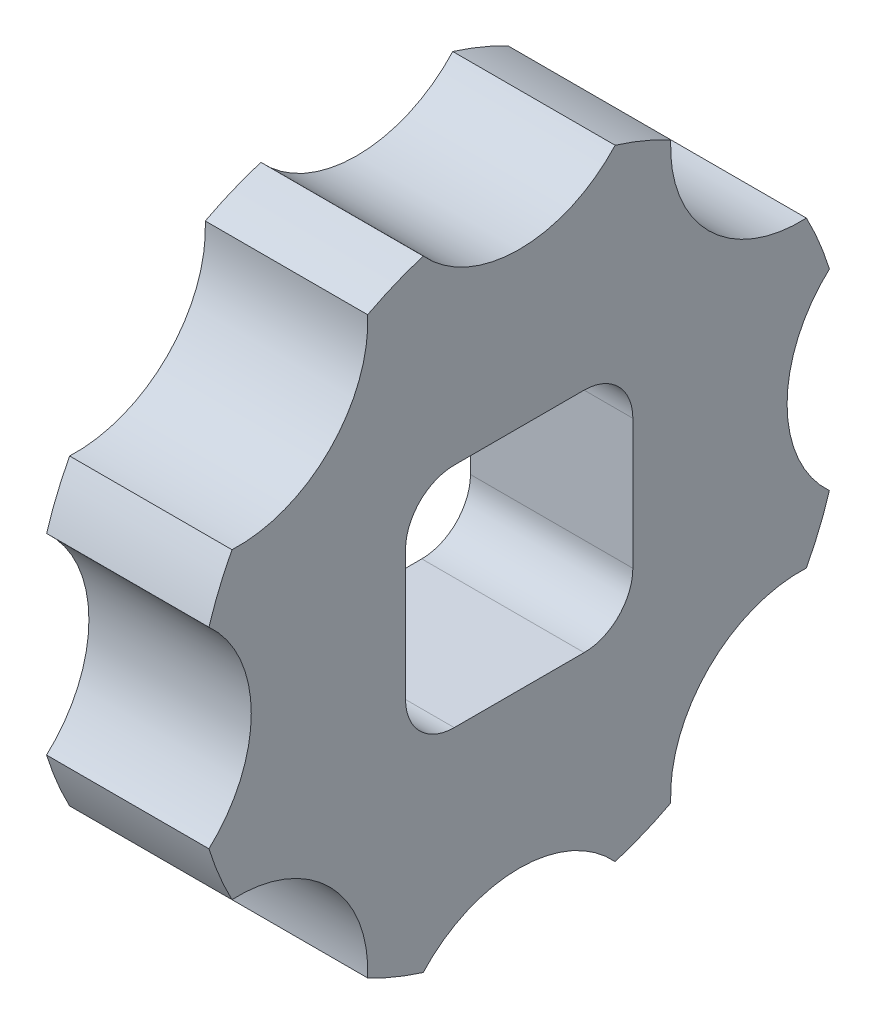
ISO-10303-21;
HEADER;
FILE_DESCRIPTION(('STEP AP214'),'2;1');
FILE_NAME('part.step','',(''),(''),'','','');
FILE_SCHEMA(('AUTOMOTIVE_DESIGN { 1 0 10303 214 1 1 1 1 }'));
ENDSEC;
DATA;
#1=APPLICATION_CONTEXT('core data for automotive mechanical design processes');
#2=APPLICATION_PROTOCOL_DEFINITION('international standard','automotive_design',2000,#1);
#3=PRODUCT_CONTEXT('',#1,'mechanical');
#4=PRODUCT('Part','Part','',(#3));
#5=PRODUCT_RELATED_PRODUCT_CATEGORY('part','',(#4));
#6=PRODUCT_DEFINITION_FORMATION('','',#4);
#7=PRODUCT_DEFINITION_CONTEXT('part definition',#1,'design');
#8=PRODUCT_DEFINITION('design','',#6,#7);
#9=PRODUCT_DEFINITION_SHAPE('','',#8);
#10=(LENGTH_UNIT() NAMED_UNIT(*) SI_UNIT(.MILLI.,.METRE.));
#11=(NAMED_UNIT(*) PLANE_ANGLE_UNIT() SI_UNIT($,.RADIAN.));
#12=(NAMED_UNIT(*) SI_UNIT($,.STERADIAN.) SOLID_ANGLE_UNIT());
#13=UNCERTAINTY_MEASURE_WITH_UNIT(LENGTH_MEASURE(1.E-05),#10,'distance_accuracy_value','');
#14=(GEOMETRIC_REPRESENTATION_CONTEXT(3) GLOBAL_UNCERTAINTY_ASSIGNED_CONTEXT((#13)) GLOBAL_UNIT_ASSIGNED_CONTEXT((#10,
#11,#12)) REPRESENTATION_CONTEXT('',''));
#15=CARTESIAN_POINT('',(0.,0.,0.));
#16=DIRECTION('',(0.,0.,1.));
#17=DIRECTION('',(1.,0.,0.));
#18=AXIS2_PLACEMENT_3D('',#15,#16,#17);
#19=CARTESIAN_POINT('',(10.,0.,0.));
#20=DIRECTION('',(-1.,0.,0.));
#21=DIRECTION('',(0.,0.,1.));
#22=AXIS2_PLACEMENT_3D('',#19,#20,#21);
#23=CYLINDRICAL_SURFACE('',#22,20.);
#24=CARTESIAN_POINT('',(0.,0.,0.));
#25=DIRECTION('',(1.,0.,0.));
#26=DIRECTION('',(0.,0.,-1.));
#27=AXIS2_PLACEMENT_3D('',#24,#25,#26);
#28=CIRCLE('',#27,20.);
#29=CARTESIAN_POINT('',(0.,-17.6891327679564,9.33244779881522));
#30=VERTEX_POINT('',#29);
#31=CARTESIAN_POINT('',(0.,-19.1071428571429,5.90906860991933));
#32=VERTEX_POINT('',#31);
#33=EDGE_CURVE('E216',#30,#32,#28,.T.);
#34=ORIENTED_EDGE('',*,*,#33,.T.);
#35=DIRECTION('',(1.,0.,0.));
#36=VECTOR('',#35,1.);
#37=CARTESIAN_POINT('',(5.,-19.1071428571429,5.90906860991933));
#38=LINE('',#37,#36);
#39=CARTESIAN_POINT('',(10.,-19.1071428571429,5.90906860991933));
#40=VERTEX_POINT('',#39);
#41=EDGE_CURVE('E62',#32,#40,#38,.T.);
#42=ORIENTED_EDGE('',*,*,#41,.T.);
#43=CARTESIAN_POINT('',(10.,0.,0.));
#44=DIRECTION('',(1.,0.,0.));
#45=DIRECTION('',(0.,0.,-1.));
#46=AXIS2_PLACEMENT_3D('',#43,#44,#45);
#47=CIRCLE('',#46,20.);
#48=CARTESIAN_POINT('',(10.,-17.6891327679564,9.33244779881522));
#49=VERTEX_POINT('',#48);
#50=EDGE_CURVE('E218',#49,#40,#47,.T.);
#51=ORIENTED_EDGE('',*,*,#50,.F.);
#52=DIRECTION('',(1.,0.,0.));
#53=VECTOR('',#52,1.);
#54=CARTESIAN_POINT('',(5.,-17.6891327679564,9.33244779881522));
#55=LINE('',#54,#53);
#56=EDGE_CURVE('E201',#49,#30,#55,.F.);
#57=ORIENTED_EDGE('',*,*,#56,.T.);
#58=EDGE_LOOP('',(#34,#42,#51,#57));
#59=FACE_BOUND('',#58,.T.);
#60=ADVANCED_FACE('F38',(#59),#23,.T.);
#61=CARTESIAN_POINT('',(10.,-19.1071428571428,-5.90906860991946));
#62=VERTEX_POINT('',#61);
#63=CARTESIAN_POINT('',(10.,-17.6891327679563,-9.33244779881534));
#64=VERTEX_POINT('',#63);
#65=EDGE_CURVE('E290',#62,#64,#47,.T.);
#66=ORIENTED_EDGE('',*,*,#65,.F.);
#67=DIRECTION('',(1.,0.,0.));
#68=VECTOR('',#67,1.);
#69=CARTESIAN_POINT('',(5.,-19.1071428571428,-5.90906860991946));
#70=LINE('',#69,#68);
#71=CARTESIAN_POINT('',(0.,-19.1071428571428,-5.90906860991946));
#72=VERTEX_POINT('',#71);
#73=EDGE_CURVE('E388',#62,#72,#70,.F.);
#74=ORIENTED_EDGE('',*,*,#73,.T.);
#75=CARTESIAN_POINT('',(0.,-17.6891327679563,-9.33244779881534));
#76=VERTEX_POINT('',#75);
#77=EDGE_CURVE('E226',#72,#76,#28,.T.);
#78=ORIENTED_EDGE('',*,*,#77,.T.);
#79=DIRECTION('',(1.,0.,0.));
#80=VECTOR('',#79,1.);
#81=CARTESIAN_POINT('',(5.,-17.6891327679563,-9.33244779881534));
#82=LINE('',#81,#80);
#83=EDGE_CURVE('E54',#76,#64,#82,.T.);
#84=ORIENTED_EDGE('',*,*,#83,.T.);
#85=EDGE_LOOP('',(#66,#74,#78,#84));
#86=FACE_BOUND('',#85,.T.);
#87=ADVANCED_FACE('F386',(#86),#23,.T.);
#88=CARTESIAN_POINT('',(0.,-5.90906860991939,19.1071428571429));
#89=VERTEX_POINT('',#88);
#90=CARTESIAN_POINT('',(0.,-9.33244779881528,17.6891327679564));
#91=VERTEX_POINT('',#90);
#92=EDGE_CURVE('E225',#89,#91,#28,.T.);
#93=ORIENTED_EDGE('',*,*,#92,.T.);
#94=DIRECTION('',(1.,0.,0.));
#95=VECTOR('',#94,1.);
#96=CARTESIAN_POINT('',(5.,-9.33244779881528,17.6891327679564));
#97=LINE('',#96,#95);
#98=CARTESIAN_POINT('',(10.,-9.33244779881528,17.6891327679564));
#99=VERTEX_POINT('',#98);
#100=EDGE_CURVE('E204',#91,#99,#97,.T.);
#101=ORIENTED_EDGE('',*,*,#100,.T.);
#102=CARTESIAN_POINT('',(10.,-5.90906860991939,19.1071428571429));
#103=VERTEX_POINT('',#102);
#104=EDGE_CURVE('E278',#103,#99,#47,.T.);
#105=ORIENTED_EDGE('',*,*,#104,.F.);
#106=DIRECTION('',(1.,0.,0.));
#107=VECTOR('',#106,1.);
#108=CARTESIAN_POINT('',(5.,-5.90906860991939,19.1071428571429));
#109=LINE('',#108,#107);
#110=EDGE_CURVE('E319',#103,#89,#109,.F.);
#111=ORIENTED_EDGE('',*,*,#110,.T.);
#112=EDGE_LOOP('',(#93,#101,#105,#111));
#113=FACE_BOUND('',#112,.T.);
#114=ADVANCED_FACE('F475',(#113),#23,.T.);
#115=CARTESIAN_POINT('',(0.,5.9090686099194,-19.1071428571429));
#116=VERTEX_POINT('',#115);
#117=CARTESIAN_POINT('',(0.,9.3324477988154,-17.6891327679563));
#118=VERTEX_POINT('',#117);
#119=EDGE_CURVE('E233',#116,#118,#28,.T.);
#120=ORIENTED_EDGE('',*,*,#119,.T.);
#121=DIRECTION('',(1.,0.,0.));
#122=VECTOR('',#121,1.);
#123=CARTESIAN_POINT('',(5.,9.3324477988154,-17.6891327679563));
#124=LINE('',#123,#122);
#125=CARTESIAN_POINT('',(10.,9.3324477988154,-17.6891327679563));
#126=VERTEX_POINT('',#125);
#127=EDGE_CURVE('E452',#118,#126,#124,.T.);
#128=ORIENTED_EDGE('',*,*,#127,.T.);
#129=CARTESIAN_POINT('',(10.,5.9090686099194,-19.1071428571429));
#130=VERTEX_POINT('',#129);
#131=EDGE_CURVE('E283',#130,#126,#47,.T.);
#132=ORIENTED_EDGE('',*,*,#131,.F.);
#133=DIRECTION('',(1.,0.,0.));
#134=VECTOR('',#133,1.);
#135=CARTESIAN_POINT('',(5.,5.9090686099194,-19.1071428571429));
#136=LINE('',#135,#134);
#137=EDGE_CURVE('E402',#130,#116,#136,.F.);
#138=ORIENTED_EDGE('',*,*,#137,.T.);
#139=EDGE_LOOP('',(#120,#128,#132,#138));
#140=FACE_BOUND('',#139,.T.);
#141=ADVANCED_FACE('F477',(#140),#23,.T.);
#142=CARTESIAN_POINT('',(10.,17.6891327679565,-9.33244779881509));
#143=VERTEX_POINT('',#142);
#144=CARTESIAN_POINT('',(10.,19.1071428571429,-5.90906860991919));
#145=VERTEX_POINT('',#144);
#146=EDGE_CURVE('E294',#143,#145,#47,.T.);
#147=ORIENTED_EDGE('',*,*,#146,.F.);
#148=DIRECTION('',(1.,0.,0.));
#149=VECTOR('',#148,1.);
#150=CARTESIAN_POINT('',(5.,17.6891327679565,-9.33244779881509));
#151=LINE('',#150,#149);
#152=CARTESIAN_POINT('',(0.,17.6891327679565,-9.33244779881509));
#153=VERTEX_POINT('',#152);
#154=EDGE_CURVE('E431',#143,#153,#151,.F.);
#155=ORIENTED_EDGE('',*,*,#154,.T.);
#156=CARTESIAN_POINT('',(0.,19.1071428571429,-5.90906860991919));
#157=VERTEX_POINT('',#156);
#158=EDGE_CURVE('E248',#153,#157,#28,.T.);
#159=ORIENTED_EDGE('',*,*,#158,.T.);
#160=DIRECTION('',(1.,0.,0.));
#161=VECTOR('',#160,1.);
#162=CARTESIAN_POINT('',(5.,19.1071428571429,-5.90906860991919));
#163=LINE('',#162,#161);
#164=EDGE_CURVE('E430',#157,#145,#163,.T.);
#165=ORIENTED_EDGE('',*,*,#164,.T.);
#166=EDGE_LOOP('',(#147,#155,#159,#165));
#167=FACE_BOUND('',#166,.T.);
#168=ADVANCED_FACE('F429',(#167),#23,.T.);
#169=CARTESIAN_POINT('',(10.,19.1071428571428,5.90906860991959));
#170=VERTEX_POINT('',#169);
#171=CARTESIAN_POINT('',(10.,17.6891327679563,9.33244779881547));
#172=VERTEX_POINT('',#171);
#173=EDGE_CURVE('E300',#170,#172,#47,.T.);
#174=ORIENTED_EDGE('',*,*,#173,.F.);
#175=DIRECTION('',(1.,0.,0.));
#176=VECTOR('',#175,1.);
#177=CARTESIAN_POINT('',(5.,19.1071428571428,5.90906860991959));
#178=LINE('',#177,#176);
#179=CARTESIAN_POINT('',(0.,19.1071428571428,5.90906860991959));
#180=VERTEX_POINT('',#179);
#181=EDGE_CURVE('E436',#170,#180,#178,.F.);
#182=ORIENTED_EDGE('',*,*,#181,.T.);
#183=CARTESIAN_POINT('',(0.,17.6891327679563,9.33244779881547));
#184=VERTEX_POINT('',#183);
#185=EDGE_CURVE('E238',#180,#184,#28,.T.);
#186=ORIENTED_EDGE('',*,*,#185,.T.);
#187=DIRECTION('',(1.,0.,0.));
#188=VECTOR('',#187,1.);
#189=CARTESIAN_POINT('',(5.,17.6891327679563,9.33244779881547));
#190=LINE('',#189,#188);
#191=EDGE_CURVE('E441',#184,#172,#190,.T.);
#192=ORIENTED_EDGE('',*,*,#191,.T.);
#193=EDGE_LOOP('',(#174,#182,#186,#192));
#194=FACE_BOUND('',#193,.T.);
#195=ADVANCED_FACE('F438',(#194),#23,.T.);
#196=CARTESIAN_POINT('',(10.,-9.33244779881516,-17.6891327679564));
#197=VERTEX_POINT('',#196);
#198=CARTESIAN_POINT('',(10.,-5.90906860991938,-19.1071428571429));
#199=VERTEX_POINT('',#198);
#200=EDGE_CURVE('E282',#197,#199,#47,.T.);
#201=ORIENTED_EDGE('',*,*,#200,.F.);
#202=DIRECTION('',(1.,0.,0.));
#203=VECTOR('',#202,1.);
#204=CARTESIAN_POINT('',(5.,-9.33244779881516,-17.6891327679564));
#205=LINE('',#204,#203);
#206=CARTESIAN_POINT('',(0.,-9.33244779881516,-17.6891327679564));
#207=VERTEX_POINT('',#206);
#208=EDGE_CURVE('E395',#197,#207,#205,.F.);
#209=ORIENTED_EDGE('',*,*,#208,.T.);
#210=CARTESIAN_POINT('',(0.,-5.90906860991939,-19.1071428571429));
#211=VERTEX_POINT('',#210);
#212=EDGE_CURVE('E232',#207,#211,#28,.T.);
#213=ORIENTED_EDGE('',*,*,#212,.T.);
#214=DIRECTION('',(1.,0.,0.));
#215=VECTOR('',#214,1.);
#216=CARTESIAN_POINT('',(5.,-5.90906860991938,-19.1071428571429));
#217=LINE('',#216,#215);
#218=EDGE_CURVE('E321',#211,#199,#217,.T.);
#219=ORIENTED_EDGE('',*,*,#218,.T.);
#220=EDGE_LOOP('',(#201,#209,#213,#219));
#221=FACE_BOUND('',#220,.T.);
#222=ADVANCED_FACE('F414',(#221),#23,.T.);
#223=CARTESIAN_POINT('',(10.,9.33244779881503,17.6891327679565));
#224=VERTEX_POINT('',#223);
#225=CARTESIAN_POINT('',(10.,5.90906860991939,19.1071428571429));
#226=VERTEX_POINT('',#225);
#227=EDGE_CURVE('E231',#224,#226,#47,.T.);
#228=ORIENTED_EDGE('',*,*,#227,.F.);
#229=DIRECTION('',(1.,0.,0.));
#230=VECTOR('',#229,1.);
#231=CARTESIAN_POINT('',(5.,9.33244779881503,17.6891327679565));
#232=LINE('',#231,#230);
#233=CARTESIAN_POINT('',(0.,9.33244779881503,17.6891327679565));
#234=VERTEX_POINT('',#233);
#235=EDGE_CURVE('E446',#224,#234,#232,.F.);
#236=ORIENTED_EDGE('',*,*,#235,.T.);
#237=CARTESIAN_POINT('',(0.,5.90906860991939,19.1071428571429));
#238=VERTEX_POINT('',#237);
#239=EDGE_CURVE('E228',#234,#238,#28,.T.);
#240=ORIENTED_EDGE('',*,*,#239,.T.);
#241=DIRECTION('',(1.,0.,0.));
#242=VECTOR('',#241,1.);
#243=CARTESIAN_POINT('',(5.,5.90906860991939,19.1071428571429));
#244=LINE('',#243,#242);
#245=EDGE_CURVE('E266',#238,#226,#244,.T.);
#246=ORIENTED_EDGE('',*,*,#245,.T.);
#247=EDGE_LOOP('',(#228,#236,#240,#246));
#248=FACE_BOUND('',#247,.T.);
#249=ADVANCED_FACE('F323',(#248),#23,.T.);
#250=CARTESIAN_POINT('',(10.,0.,0.));
#251=DIRECTION('',(1.,0.,0.));
#252=DIRECTION('',(0.,0.,-1.));
#253=AXIS2_PLACEMENT_3D('',#250,#251,#252);
#254=PLANE('',#253);
#255=CARTESIAN_POINT('',(10.,-24.5,0.));
#256=DIRECTION('',(1.,0.,0.));
#257=DIRECTION('',(0.,1.,0.));
#258=AXIS2_PLACEMENT_3D('',#255,#256,#257);
#259=CIRCLE('',#258,8.);
#260=EDGE_CURVE('E459',#62,#40,#259,.T.);
#261=ORIENTED_EDGE('',*,*,#260,.F.);
#262=ORIENTED_EDGE('',*,*,#65,.T.);
#263=CARTESIAN_POINT('',(10.,-17.3241161390703,-17.3241161390705));
#264=DIRECTION('',(1.,0.,0.));
#265=DIRECTION('',(0.,0.707106781186544,0.707106781186551));
#266=AXIS2_PLACEMENT_3D('',#263,#264,#265);
#267=CIRCLE('',#266,8.);
#268=EDGE_CURVE('E457',#197,#64,#267,.T.);
#269=ORIENTED_EDGE('',*,*,#268,.F.);
#270=ORIENTED_EDGE('',*,*,#200,.T.);
#271=CARTESIAN_POINT('',(10.,0.,-24.5));
#272=DIRECTION('',(1.,0.,0.));
#273=DIRECTION('',(0.,0.,-1.));
#274=AXIS2_PLACEMENT_3D('',#271,#272,#273);
#275=CIRCLE('',#274,8.);
#276=EDGE_CURVE('E393',#130,#199,#275,.T.);
#277=ORIENTED_EDGE('',*,*,#276,.F.);
#278=ORIENTED_EDGE('',*,*,#131,.T.);
#279=CARTESIAN_POINT('',(10.,17.3241161390706,-17.3241161390703));
#280=DIRECTION('',(1.,0.,0.));
#281=DIRECTION('',(0.,-0.707106781186554,0.707106781186541));
#282=AXIS2_PLACEMENT_3D('',#279,#280,#281);
#283=CIRCLE('',#282,8.);
#284=EDGE_CURVE('E460',#143,#126,#283,.T.);
#285=ORIENTED_EDGE('',*,*,#284,.F.);
#286=ORIENTED_EDGE('',*,*,#146,.T.);
#287=CARTESIAN_POINT('',(10.,24.5,2.5662387840497E-13));
#288=DIRECTION('',(1.,0.,0.));
#289=DIRECTION('',(0.,-1.,0.));
#290=AXIS2_PLACEMENT_3D('',#287,#288,#289);
#291=CIRCLE('',#290,8.);
#292=EDGE_CURVE('E465',#170,#145,#291,.T.);
#293=ORIENTED_EDGE('',*,*,#292,.F.);
#294=ORIENTED_EDGE('',*,*,#173,.T.);
#295=CARTESIAN_POINT('',(10.,17.3241161390702,17.3241161390706));
#296=DIRECTION('',(1.,0.,0.));
#297=DIRECTION('',(0.,-0.707106781186539,-0.707106781186556));
#298=AXIS2_PLACEMENT_3D('',#295,#296,#297);
#299=CIRCLE('',#298,8.);
#300=EDGE_CURVE('E314',#224,#172,#299,.T.);
#301=ORIENTED_EDGE('',*,*,#300,.F.);
#302=ORIENTED_EDGE('',*,*,#227,.T.);
#303=CARTESIAN_POINT('',(10.,0.,24.5));
#304=DIRECTION('',(1.,0.,0.));
#305=DIRECTION('',(0.,0.,-1.));
#306=AXIS2_PLACEMENT_3D('',#303,#304,#305);
#307=CIRCLE('',#306,8.);
#308=EDGE_CURVE('E313',#103,#226,#307,.T.);
#309=ORIENTED_EDGE('',*,*,#308,.F.);
#310=ORIENTED_EDGE('',*,*,#104,.T.);
#311=CARTESIAN_POINT('',(10.,-17.3241161390704,17.3241161390704));
#312=DIRECTION('',(1.,0.,0.));
#313=DIRECTION('',(0.,0.707106781186549,-0.707106781186546));
#314=AXIS2_PLACEMENT_3D('',#311,#312,#313);
#315=CIRCLE('',#314,8.);
#316=EDGE_CURVE('E220',#49,#99,#315,.T.);
#317=ORIENTED_EDGE('',*,*,#316,.F.);
#318=ORIENTED_EDGE('',*,*,#50,.T.);
#319=EDGE_LOOP('',(#261,#262,#269,#270,#277,#278,#285,#286,#293,#294,#301,#302,#309,#310,#317,#318));
#320=FACE_BOUND('',#319,.T.);
#321=DIRECTION('',(0.,-1.,0.));
#322=VECTOR('',#321,1.);
#323=CARTESIAN_POINT('',(10.,-7.,7.));
#324=LINE('',#323,#322);
#325=CARTESIAN_POINT('',(10.,4.,7.));
#326=VERTEX_POINT('',#325);
#327=CARTESIAN_POINT('',(10.,-4.,7.));
#328=VERTEX_POINT('',#327);
#329=EDGE_CURVE('E261',#326,#328,#324,.T.);
#330=ORIENTED_EDGE('',*,*,#329,.F.);
#331=CARTESIAN_POINT('',(10.,4.,4.));
#332=DIRECTION('',(1.,0.,0.));
#333=DIRECTION('',(0.,0.,-1.));
#334=AXIS2_PLACEMENT_3D('',#331,#332,#333);
#335=CIRCLE('',#334,3.);
#336=CARTESIAN_POINT('',(10.,7.,4.));
#337=VERTEX_POINT('',#336);
#338=EDGE_CURVE('E349',#326,#337,#335,.F.);
#339=ORIENTED_EDGE('',*,*,#338,.T.);
#340=DIRECTION('',(0.,0.,1.));
#341=VECTOR('',#340,1.);
#342=CARTESIAN_POINT('',(10.,7.,-7.));
#343=LINE('',#342,#341);
#344=CARTESIAN_POINT('',(10.,7.,-4.));
#345=VERTEX_POINT('',#344);
#346=EDGE_CURVE('E274',#345,#337,#343,.T.);
#347=ORIENTED_EDGE('',*,*,#346,.F.);
#348=CARTESIAN_POINT('',(10.,4.,-4.));
#349=DIRECTION('',(1.,0.,0.));
#350=DIRECTION('',(0.,0.,-1.));
#351=AXIS2_PLACEMENT_3D('',#348,#349,#350);
#352=CIRCLE('',#351,3.);
#353=CARTESIAN_POINT('',(10.,4.,-7.));
#354=VERTEX_POINT('',#353);
#355=EDGE_CURVE('E361',#345,#354,#352,.F.);
#356=ORIENTED_EDGE('',*,*,#355,.T.);
#357=DIRECTION('',(0.,1.,0.));
#358=VECTOR('',#357,1.);
#359=CARTESIAN_POINT('',(10.,-7.,-7.));
#360=LINE('',#359,#358);
#361=CARTESIAN_POINT('',(10.,-4.,-7.));
#362=VERTEX_POINT('',#361);
#363=EDGE_CURVE('E270',#362,#354,#360,.T.);
#364=ORIENTED_EDGE('',*,*,#363,.F.);
#365=CARTESIAN_POINT('',(10.,-4.,-4.));
#366=DIRECTION('',(1.,0.,0.));
#367=DIRECTION('',(0.,0.,-1.));
#368=AXIS2_PLACEMENT_3D('',#365,#366,#367);
#369=CIRCLE('',#368,3.);
#370=CARTESIAN_POINT('',(10.,-7.,-4.));
#371=VERTEX_POINT('',#370);
#372=EDGE_CURVE('E350',#362,#371,#369,.F.);
#373=ORIENTED_EDGE('',*,*,#372,.T.);
#374=DIRECTION('',(0.,0.,-1.));
#375=VECTOR('',#374,1.);
#376=CARTESIAN_POINT('',(10.,-7.,-7.));
#377=LINE('',#376,#375);
#378=CARTESIAN_POINT('',(10.,-7.,4.));
#379=VERTEX_POINT('',#378);
#380=EDGE_CURVE('E265',#379,#371,#377,.T.);
#381=ORIENTED_EDGE('',*,*,#380,.F.);
#382=CARTESIAN_POINT('',(10.,-4.,4.));
#383=DIRECTION('',(1.,0.,0.));
#384=DIRECTION('',(0.,0.,-1.));
#385=AXIS2_PLACEMENT_3D('',#382,#383,#384);
#386=CIRCLE('',#385,3.);
#387=EDGE_CURVE('E702',#379,#328,#386,.F.);
#388=ORIENTED_EDGE('',*,*,#387,.T.);
#389=EDGE_LOOP('',(#330,#339,#347,#356,#364,#373,#381,#388));
#390=FACE_BOUND('',#389,.T.);
#391=ADVANCED_FACE('F311',(#320,#390),#254,.T.);
#392=CARTESIAN_POINT('',(0.,0.,0.));
#393=DIRECTION('',(1.,0.,0.));
#394=DIRECTION('',(0.,0.,-1.));
#395=AXIS2_PLACEMENT_3D('',#392,#393,#394);
#396=PLANE('',#395);
#397=DIRECTION('',(0.,1.,0.));
#398=VECTOR('',#397,1.);
#399=CARTESIAN_POINT('',(0.,-7.,-7.));
#400=LINE('',#399,#398);
#401=CARTESIAN_POINT('',(0.,-4.,-7.));
#402=VERTEX_POINT('',#401);
#403=CARTESIAN_POINT('',(0.,4.,-7.));
#404=VERTEX_POINT('',#403);
#405=EDGE_CURVE('E250',#402,#404,#400,.T.);
#406=ORIENTED_EDGE('',*,*,#405,.T.);
#407=CARTESIAN_POINT('',(0.,4.,-4.));
#408=DIRECTION('',(1.,0.,0.));
#409=DIRECTION('',(0.,0.,-1.));
#410=AXIS2_PLACEMENT_3D('',#407,#408,#409);
#411=CIRCLE('',#410,3.);
#412=CARTESIAN_POINT('',(0.,7.,-4.));
#413=VERTEX_POINT('',#412);
#414=EDGE_CURVE('E364',#404,#413,#411,.T.);
#415=ORIENTED_EDGE('',*,*,#414,.T.);
#416=DIRECTION('',(0.,0.,1.));
#417=VECTOR('',#416,1.);
#418=CARTESIAN_POINT('',(0.,7.,-7.));
#419=LINE('',#418,#417);
#420=CARTESIAN_POINT('',(0.,7.,4.));
#421=VERTEX_POINT('',#420);
#422=EDGE_CURVE('E239',#413,#421,#419,.T.);
#423=ORIENTED_EDGE('',*,*,#422,.T.);
#424=CARTESIAN_POINT('',(0.,4.,4.));
#425=DIRECTION('',(1.,0.,0.));
#426=DIRECTION('',(0.,0.,-1.));
#427=AXIS2_PLACEMENT_3D('',#424,#425,#426);
#428=CIRCLE('',#427,3.);
#429=CARTESIAN_POINT('',(0.,4.,7.));
#430=VERTEX_POINT('',#429);
#431=EDGE_CURVE('E354',#421,#430,#428,.T.);
#432=ORIENTED_EDGE('',*,*,#431,.T.);
#433=DIRECTION('',(0.,-1.,0.));
#434=VECTOR('',#433,1.);
#435=CARTESIAN_POINT('',(0.,-7.,7.));
#436=LINE('',#435,#434);
#437=CARTESIAN_POINT('',(0.,-4.,7.));
#438=VERTEX_POINT('',#437);
#439=EDGE_CURVE('E277',#430,#438,#436,.T.);
#440=ORIENTED_EDGE('',*,*,#439,.T.);
#441=CARTESIAN_POINT('',(0.,-4.,4.));
#442=DIRECTION('',(1.,0.,0.));
#443=DIRECTION('',(0.,0.,-1.));
#444=AXIS2_PLACEMENT_3D('',#441,#442,#443);
#445=CIRCLE('',#444,3.);
#446=CARTESIAN_POINT('',(0.,-7.,4.));
#447=VERTEX_POINT('',#446);
#448=EDGE_CURVE('E338',#438,#447,#445,.T.);
#449=ORIENTED_EDGE('',*,*,#448,.T.);
#450=DIRECTION('',(0.,0.,-1.));
#451=VECTOR('',#450,1.);
#452=CARTESIAN_POINT('',(0.,-7.,-7.));
#453=LINE('',#452,#451);
#454=CARTESIAN_POINT('',(0.,-7.,-4.));
#455=VERTEX_POINT('',#454);
#456=EDGE_CURVE('E257',#447,#455,#453,.T.);
#457=ORIENTED_EDGE('',*,*,#456,.T.);
#458=CARTESIAN_POINT('',(0.,-4.,-4.));
#459=DIRECTION('',(1.,0.,0.));
#460=DIRECTION('',(0.,0.,-1.));
#461=AXIS2_PLACEMENT_3D('',#458,#459,#460);
#462=CIRCLE('',#461,3.);
#463=EDGE_CURVE('E335',#455,#402,#462,.T.);
#464=ORIENTED_EDGE('',*,*,#463,.T.);
#465=EDGE_LOOP('',(#406,#415,#423,#432,#440,#449,#457,#464));
#466=FACE_BOUND('',#465,.T.);
#467=ORIENTED_EDGE('',*,*,#77,.F.);
#468=CARTESIAN_POINT('',(0.,-24.5,0.));
#469=DIRECTION('',(1.,0.,0.));
#470=DIRECTION('',(0.,0.,-1.));
#471=AXIS2_PLACEMENT_3D('',#468,#469,#470);
#472=CIRCLE('',#471,8.);
#473=EDGE_CURVE('E11',#72,#32,#472,.T.);
#474=ORIENTED_EDGE('',*,*,#473,.T.);
#475=ORIENTED_EDGE('',*,*,#33,.F.);
#476=CARTESIAN_POINT('',(0.,-17.3241161390704,17.3241161390704));
#477=DIRECTION('',(1.,0.,0.));
#478=DIRECTION('',(0.,0.,-1.));
#479=AXIS2_PLACEMENT_3D('',#476,#477,#478);
#480=CIRCLE('',#479,8.);
#481=EDGE_CURVE('E198',#30,#91,#480,.T.);
#482=ORIENTED_EDGE('',*,*,#481,.T.);
#483=ORIENTED_EDGE('',*,*,#92,.F.);
#484=CARTESIAN_POINT('',(0.,0.,24.5));
#485=DIRECTION('',(1.,0.,0.));
#486=DIRECTION('',(0.,0.,-1.));
#487=AXIS2_PLACEMENT_3D('',#484,#485,#486);
#488=CIRCLE('',#487,8.);
#489=EDGE_CURVE('E211',#89,#238,#488,.T.);
#490=ORIENTED_EDGE('',*,*,#489,.T.);
#491=ORIENTED_EDGE('',*,*,#239,.F.);
#492=CARTESIAN_POINT('',(0.,17.3241161390702,17.3241161390706));
#493=DIRECTION('',(1.,0.,0.));
#494=DIRECTION('',(0.,0.,-1.));
#495=AXIS2_PLACEMENT_3D('',#492,#493,#494);
#496=CIRCLE('',#495,8.);
#497=EDGE_CURVE('E210',#234,#184,#496,.T.);
#498=ORIENTED_EDGE('',*,*,#497,.T.);
#499=ORIENTED_EDGE('',*,*,#185,.F.);
#500=CARTESIAN_POINT('',(0.,24.5,2.5662387840497E-13));
#501=DIRECTION('',(1.,0.,0.));
#502=DIRECTION('',(0.,0.,-1.));
#503=AXIS2_PLACEMENT_3D('',#500,#501,#502);
#504=CIRCLE('',#503,8.);
#505=EDGE_CURVE('E372',#180,#157,#504,.T.);
#506=ORIENTED_EDGE('',*,*,#505,.T.);
#507=ORIENTED_EDGE('',*,*,#158,.F.);
#508=CARTESIAN_POINT('',(0.,17.3241161390706,-17.3241161390703));
#509=DIRECTION('',(1.,0.,0.));
#510=DIRECTION('',(0.,0.,-1.));
#511=AXIS2_PLACEMENT_3D('',#508,#509,#510);
#512=CIRCLE('',#511,8.);
#513=EDGE_CURVE('E376',#153,#118,#512,.T.);
#514=ORIENTED_EDGE('',*,*,#513,.T.);
#515=ORIENTED_EDGE('',*,*,#119,.F.);
#516=CARTESIAN_POINT('',(0.,0.,-24.5));
#517=DIRECTION('',(1.,0.,0.));
#518=DIRECTION('',(0.,0.,-1.));
#519=AXIS2_PLACEMENT_3D('',#516,#517,#518);
#520=CIRCLE('',#519,8.);
#521=EDGE_CURVE('E399',#116,#211,#520,.T.);
#522=ORIENTED_EDGE('',*,*,#521,.T.);
#523=ORIENTED_EDGE('',*,*,#212,.F.);
#524=CARTESIAN_POINT('',(0.,-17.3241161390703,-17.3241161390705));
#525=DIRECTION('',(1.,0.,0.));
#526=DIRECTION('',(0.,0.,-1.));
#527=AXIS2_PLACEMENT_3D('',#524,#525,#526);
#528=CIRCLE('',#527,8.);
#529=EDGE_CURVE('E47',#207,#76,#528,.T.);
#530=ORIENTED_EDGE('',*,*,#529,.T.);
#531=EDGE_LOOP('',(#467,#474,#475,#482,#483,#490,#491,#498,#499,#506,#507,#514,#515,#522,#523,#530));
#532=FACE_BOUND('',#531,.T.);
#533=ADVANCED_FACE('F223',(#466,#532),#396,.F.);
#534=CARTESIAN_POINT('',(0.,-7.,7.));
#535=DIRECTION('',(0.,0.,1.));
#536=DIRECTION('',(1.,0.,0.));
#537=AXIS2_PLACEMENT_3D('',#534,#535,#536);
#538=PLANE('',#537);
#539=ORIENTED_EDGE('',*,*,#329,.T.);
#540=DIRECTION('',(1.,0.,0.));
#541=VECTOR('',#540,1.);
#542=CARTESIAN_POINT('',(0.,-4.,7.));
#543=LINE('',#542,#541);
#544=EDGE_CURVE('E699',#328,#438,#543,.F.);
#545=ORIENTED_EDGE('',*,*,#544,.T.);
#546=ORIENTED_EDGE('',*,*,#439,.F.);
#547=DIRECTION('',(1.,0.,0.));
#548=VECTOR('',#547,1.);
#549=CARTESIAN_POINT('',(10.,4.,7.));
#550=LINE('',#549,#548);
#551=EDGE_CURVE('E701',#430,#326,#550,.T.);
#552=ORIENTED_EDGE('',*,*,#551,.T.);
#553=EDGE_LOOP('',(#539,#545,#546,#552));
#554=FACE_BOUND('',#553,.T.);
#555=ADVANCED_FACE('F603',(#554),#538,.F.);
#556=CARTESIAN_POINT('',(0.,7.,-7.));
#557=DIRECTION('',(0.,1.,0.));
#558=DIRECTION('',(0.,0.,1.));
#559=AXIS2_PLACEMENT_3D('',#556,#557,#558);
#560=PLANE('',#559);
#561=ORIENTED_EDGE('',*,*,#346,.T.);
#562=DIRECTION('',(1.,0.,0.));
#563=VECTOR('',#562,1.);
#564=CARTESIAN_POINT('',(0.,7.,4.));
#565=LINE('',#564,#563);
#566=EDGE_CURVE('E718',#337,#421,#565,.F.);
#567=ORIENTED_EDGE('',*,*,#566,.T.);
#568=ORIENTED_EDGE('',*,*,#422,.F.);
#569=DIRECTION('',(1.,0.,0.));
#570=VECTOR('',#569,1.);
#571=CARTESIAN_POINT('',(10.,7.,-4.));
#572=LINE('',#571,#570);
#573=EDGE_CURVE('E714',#413,#345,#572,.T.);
#574=ORIENTED_EDGE('',*,*,#573,.T.);
#575=EDGE_LOOP('',(#561,#567,#568,#574));
#576=FACE_BOUND('',#575,.T.);
#577=ADVANCED_FACE('F593',(#576),#560,.F.);
#578=CARTESIAN_POINT('',(0.,-7.,-7.));
#579=DIRECTION('',(0.,0.,-1.));
#580=DIRECTION('',(-1.,0.,0.));
#581=AXIS2_PLACEMENT_3D('',#578,#579,#580);
#582=PLANE('',#581);
#583=ORIENTED_EDGE('',*,*,#405,.F.);
#584=DIRECTION('',(1.,0.,0.));
#585=VECTOR('',#584,1.);
#586=CARTESIAN_POINT('',(10.,-4.,-7.));
#587=LINE('',#586,#585);
#588=EDGE_CURVE('E347',#402,#362,#587,.T.);
#589=ORIENTED_EDGE('',*,*,#588,.T.);
#590=ORIENTED_EDGE('',*,*,#363,.T.);
#591=DIRECTION('',(1.,0.,0.));
#592=VECTOR('',#591,1.);
#593=CARTESIAN_POINT('',(0.,4.,-7.));
#594=LINE('',#593,#592);
#595=EDGE_CURVE('E704',#354,#404,#594,.F.);
#596=ORIENTED_EDGE('',*,*,#595,.T.);
#597=EDGE_LOOP('',(#583,#589,#590,#596));
#598=FACE_BOUND('',#597,.T.);
#599=ADVANCED_FACE('F584',(#598),#582,.F.);
#600=CARTESIAN_POINT('',(0.,-7.,-7.));
#601=DIRECTION('',(0.,-1.,0.));
#602=DIRECTION('',(0.,0.,-1.));
#603=AXIS2_PLACEMENT_3D('',#600,#601,#602);
#604=PLANE('',#603);
#605=ORIENTED_EDGE('',*,*,#456,.F.);
#606=DIRECTION('',(1.,0.,0.));
#607=VECTOR('',#606,1.);
#608=CARTESIAN_POINT('',(10.,-7.,4.));
#609=LINE('',#608,#607);
#610=EDGE_CURVE('E289',#447,#379,#609,.T.);
#611=ORIENTED_EDGE('',*,*,#610,.T.);
#612=ORIENTED_EDGE('',*,*,#380,.T.);
#613=DIRECTION('',(1.,0.,0.));
#614=VECTOR('',#613,1.);
#615=CARTESIAN_POINT('',(0.,-7.,-4.));
#616=LINE('',#615,#614);
#617=EDGE_CURVE('E281',#371,#455,#616,.F.);
#618=ORIENTED_EDGE('',*,*,#617,.T.);
#619=EDGE_LOOP('',(#605,#611,#612,#618));
#620=FACE_BOUND('',#619,.T.);
#621=ADVANCED_FACE('F575',(#620),#604,.F.);
#622=CARTESIAN_POINT('',(0.,-4.,4.));
#623=DIRECTION('',(-1.,0.,0.));
#624=DIRECTION('',(0.,0.,1.));
#625=AXIS2_PLACEMENT_3D('',#622,#623,#624);
#626=CYLINDRICAL_SURFACE('',#625,3.);
#627=ORIENTED_EDGE('',*,*,#448,.F.);
#628=ORIENTED_EDGE('',*,*,#544,.F.);
#629=ORIENTED_EDGE('',*,*,#387,.F.);
#630=ORIENTED_EDGE('',*,*,#610,.F.);
#631=EDGE_LOOP('',(#627,#628,#629,#630));
#632=FACE_BOUND('',#631,.T.);
#633=ADVANCED_FACE('F566',(#632),#626,.F.);
#634=CARTESIAN_POINT('',(0.,-4.,-4.));
#635=DIRECTION('',(-1.,0.,0.));
#636=DIRECTION('',(0.,0.,1.));
#637=AXIS2_PLACEMENT_3D('',#634,#635,#636);
#638=CYLINDRICAL_SURFACE('',#637,3.);
#639=ORIENTED_EDGE('',*,*,#463,.F.);
#640=ORIENTED_EDGE('',*,*,#617,.F.);
#641=ORIENTED_EDGE('',*,*,#372,.F.);
#642=ORIENTED_EDGE('',*,*,#588,.F.);
#643=EDGE_LOOP('',(#639,#640,#641,#642));
#644=FACE_BOUND('',#643,.T.);
#645=ADVANCED_FACE('F345',(#644),#638,.F.);
#646=CARTESIAN_POINT('',(0.,4.,4.));
#647=DIRECTION('',(-1.,0.,0.));
#648=DIRECTION('',(0.,0.,1.));
#649=AXIS2_PLACEMENT_3D('',#646,#647,#648);
#650=CYLINDRICAL_SURFACE('',#649,3.);
#651=ORIENTED_EDGE('',*,*,#431,.F.);
#652=ORIENTED_EDGE('',*,*,#566,.F.);
#653=ORIENTED_EDGE('',*,*,#338,.F.);
#654=ORIENTED_EDGE('',*,*,#551,.F.);
#655=EDGE_LOOP('',(#651,#652,#653,#654));
#656=FACE_BOUND('',#655,.T.);
#657=ADVANCED_FACE('F549',(#656),#650,.F.);
#658=CARTESIAN_POINT('',(0.,4.,-4.));
#659=DIRECTION('',(-1.,0.,0.));
#660=DIRECTION('',(0.,0.,1.));
#661=AXIS2_PLACEMENT_3D('',#658,#659,#660);
#662=CYLINDRICAL_SURFACE('',#661,3.);
#663=ORIENTED_EDGE('',*,*,#414,.F.);
#664=ORIENTED_EDGE('',*,*,#595,.F.);
#665=ORIENTED_EDGE('',*,*,#355,.F.);
#666=ORIENTED_EDGE('',*,*,#573,.F.);
#667=EDGE_LOOP('',(#663,#664,#665,#666));
#668=FACE_BOUND('',#667,.T.);
#669=ADVANCED_FACE('F40',(#668),#662,.F.);
#670=CARTESIAN_POINT('',(0.,0.,24.5));
#671=DIRECTION('',(1.,0.,0.));
#672=DIRECTION('',(0.,0.,-1.));
#673=AXIS2_PLACEMENT_3D('',#670,#671,#672);
#674=CYLINDRICAL_SURFACE('',#673,8.);
#675=ORIENTED_EDGE('',*,*,#489,.F.);
#676=ORIENTED_EDGE('',*,*,#110,.F.);
#677=ORIENTED_EDGE('',*,*,#308,.T.);
#678=ORIENTED_EDGE('',*,*,#245,.F.);
#679=EDGE_LOOP('',(#675,#676,#677,#678));
#680=FACE_BOUND('',#679,.T.);
#681=ADVANCED_FACE('F316',(#680),#674,.F.);
#682=CARTESIAN_POINT('',(0.,0.,-24.5));
#683=DIRECTION('',(1.,0.,0.));
#684=DIRECTION('',(0.,0.,-1.));
#685=AXIS2_PLACEMENT_3D('',#682,#683,#684);
#686=CYLINDRICAL_SURFACE('',#685,8.);
#687=ORIENTED_EDGE('',*,*,#521,.F.);
#688=ORIENTED_EDGE('',*,*,#137,.F.);
#689=ORIENTED_EDGE('',*,*,#276,.T.);
#690=ORIENTED_EDGE('',*,*,#218,.F.);
#691=EDGE_LOOP('',(#687,#688,#689,#690));
#692=FACE_BOUND('',#691,.T.);
#693=ADVANCED_FACE('F416',(#692),#686,.F.);
#694=CARTESIAN_POINT('',(0.,-17.3241161390704,17.3241161390704));
#695=DIRECTION('',(1.,0.,0.));
#696=DIRECTION('',(0.,0.,-1.));
#697=AXIS2_PLACEMENT_3D('',#694,#695,#696);
#698=CYLINDRICAL_SURFACE('',#697,8.);
#699=ORIENTED_EDGE('',*,*,#481,.F.);
#700=ORIENTED_EDGE('',*,*,#56,.F.);
#701=ORIENTED_EDGE('',*,*,#316,.T.);
#702=ORIENTED_EDGE('',*,*,#100,.F.);
#703=EDGE_LOOP('',(#699,#700,#701,#702));
#704=FACE_BOUND('',#703,.T.);
#705=ADVANCED_FACE('F200',(#704),#698,.F.);
#706=CARTESIAN_POINT('',(0.,17.3241161390702,17.3241161390706));
#707=DIRECTION('',(1.,0.,0.));
#708=DIRECTION('',(0.,0.,-1.));
#709=AXIS2_PLACEMENT_3D('',#706,#707,#708);
#710=CYLINDRICAL_SURFACE('',#709,8.);
#711=ORIENTED_EDGE('',*,*,#497,.F.);
#712=ORIENTED_EDGE('',*,*,#235,.F.);
#713=ORIENTED_EDGE('',*,*,#300,.T.);
#714=ORIENTED_EDGE('',*,*,#191,.F.);
#715=EDGE_LOOP('',(#711,#712,#713,#714));
#716=FACE_BOUND('',#715,.T.);
#717=ADVANCED_FACE('F645',(#716),#710,.F.);
#718=CARTESIAN_POINT('',(0.,24.5,2.5662387840497E-13));
#719=DIRECTION('',(1.,0.,0.));
#720=DIRECTION('',(0.,0.,-1.));
#721=AXIS2_PLACEMENT_3D('',#718,#719,#720);
#722=CYLINDRICAL_SURFACE('',#721,8.);
#723=ORIENTED_EDGE('',*,*,#505,.F.);
#724=ORIENTED_EDGE('',*,*,#181,.F.);
#725=ORIENTED_EDGE('',*,*,#292,.T.);
#726=ORIENTED_EDGE('',*,*,#164,.F.);
#727=EDGE_LOOP('',(#723,#724,#725,#726));
#728=FACE_BOUND('',#727,.T.);
#729=ADVANCED_FACE('F435',(#728),#722,.F.);
#730=CARTESIAN_POINT('',(0.,17.3241161390706,-17.3241161390703));
#731=DIRECTION('',(1.,0.,0.));
#732=DIRECTION('',(0.,0.,-1.));
#733=AXIS2_PLACEMENT_3D('',#730,#731,#732);
#734=CYLINDRICAL_SURFACE('',#733,8.);
#735=ORIENTED_EDGE('',*,*,#513,.F.);
#736=ORIENTED_EDGE('',*,*,#154,.F.);
#737=ORIENTED_EDGE('',*,*,#284,.T.);
#738=ORIENTED_EDGE('',*,*,#127,.F.);
#739=EDGE_LOOP('',(#735,#736,#737,#738));
#740=FACE_BOUND('',#739,.T.);
#741=ADVANCED_FACE('F662',(#740),#734,.F.);
#742=CARTESIAN_POINT('',(0.,-17.3241161390703,-17.3241161390705));
#743=DIRECTION('',(1.,0.,0.));
#744=DIRECTION('',(0.,0.,-1.));
#745=AXIS2_PLACEMENT_3D('',#742,#743,#744);
#746=CYLINDRICAL_SURFACE('',#745,8.);
#747=ORIENTED_EDGE('',*,*,#529,.F.);
#748=ORIENTED_EDGE('',*,*,#208,.F.);
#749=ORIENTED_EDGE('',*,*,#268,.T.);
#750=ORIENTED_EDGE('',*,*,#83,.F.);
#751=EDGE_LOOP('',(#747,#748,#749,#750));
#752=FACE_BOUND('',#751,.T.);
#753=ADVANCED_FACE('F456',(#752),#746,.F.);
#754=CARTESIAN_POINT('',(0.,-24.5,0.));
#755=DIRECTION('',(1.,0.,0.));
#756=DIRECTION('',(0.,0.,-1.));
#757=AXIS2_PLACEMENT_3D('',#754,#755,#756);
#758=CYLINDRICAL_SURFACE('',#757,8.);
#759=ORIENTED_EDGE('',*,*,#473,.F.);
#760=ORIENTED_EDGE('',*,*,#73,.F.);
#761=ORIENTED_EDGE('',*,*,#260,.T.);
#762=ORIENTED_EDGE('',*,*,#41,.F.);
#763=EDGE_LOOP('',(#759,#760,#761,#762));
#764=FACE_BOUND('',#763,.T.);
#765=ADVANCED_FACE('F680',(#764),#758,.F.);
#766=CLOSED_SHELL('',(#60,#87,#114,#141,#168,#195,#222,#249,#391,#533,#555,#577,#599,#621,#633,
#645,#657,#669,#681,#693,#705,#717,#729,#741,#753,#765));
#767=MANIFOLD_SOLID_BREP('B2',#766);
#768=ADVANCED_BREP_SHAPE_REPRESENTATION('',(#18,#767),#14);
#769=SHAPE_DEFINITION_REPRESENTATION(#9,#768);
ENDSEC;
END-ISO-10303-21;
